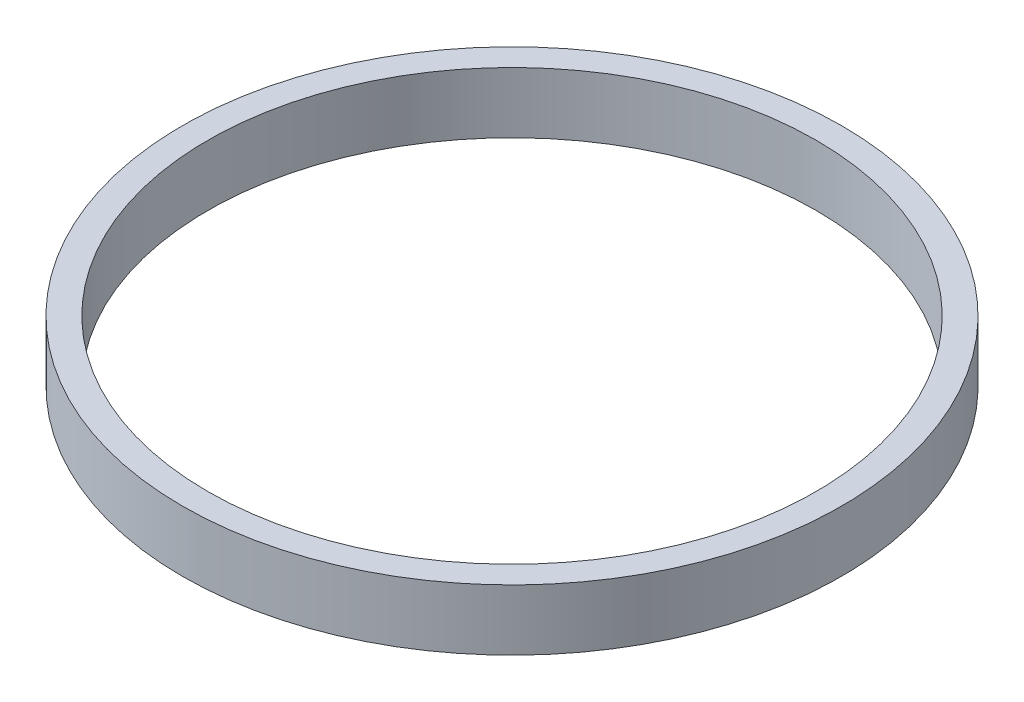
ISO-10303-21;
HEADER;
FILE_DESCRIPTION(('STEP AP214'),'2;1');
FILE_NAME('part.step','',(''),(''),'','','');
FILE_SCHEMA(('AUTOMOTIVE_DESIGN { 1 0 10303 214 1 1 1 1 }'));
ENDSEC;
DATA;
#1=APPLICATION_CONTEXT('core data for automotive mechanical design processes');
#2=APPLICATION_PROTOCOL_DEFINITION('international standard','automotive_design',2000,#1);
#3=PRODUCT_CONTEXT('',#1,'mechanical');
#4=PRODUCT('Part','Part','',(#3));
#5=PRODUCT_RELATED_PRODUCT_CATEGORY('part','',(#4));
#6=PRODUCT_DEFINITION_FORMATION('','',#4);
#7=PRODUCT_DEFINITION_CONTEXT('part definition',#1,'design');
#8=PRODUCT_DEFINITION('design','',#6,#7);
#9=PRODUCT_DEFINITION_SHAPE('','',#8);
#10=(LENGTH_UNIT() NAMED_UNIT(*) SI_UNIT(.MILLI.,.METRE.));
#11=(NAMED_UNIT(*) PLANE_ANGLE_UNIT() SI_UNIT($,.RADIAN.));
#12=(NAMED_UNIT(*) SI_UNIT($,.STERADIAN.) SOLID_ANGLE_UNIT());
#13=UNCERTAINTY_MEASURE_WITH_UNIT(LENGTH_MEASURE(1.E-05),#10,'distance_accuracy_value','');
#14=(GEOMETRIC_REPRESENTATION_CONTEXT(3) GLOBAL_UNCERTAINTY_ASSIGNED_CONTEXT((#13)) GLOBAL_UNIT_ASSIGNED_CONTEXT((#10,
#11,#12)) REPRESENTATION_CONTEXT('',''));
#15=CARTESIAN_POINT('',(0.,0.,0.));
#16=DIRECTION('',(0.,0.,1.));
#17=DIRECTION('',(1.,0.,0.));
#18=AXIS2_PLACEMENT_3D('',#15,#16,#17);
#19=CARTESIAN_POINT('',(0.,6.,0.));
#20=DIRECTION('',(0.,1.,0.));
#21=DIRECTION('',(0.,0.,1.));
#22=AXIS2_PLACEMENT_3D('',#19,#20,#21);
#23=PLANE('',#22);
#24=CARTESIAN_POINT('',(0.,6.,0.));
#25=DIRECTION('',(0.,1.,0.));
#26=DIRECTION('',(0.,0.,1.));
#27=AXIS2_PLACEMENT_3D('',#24,#25,#26);
#28=CIRCLE('',#27,32.5);
#29=CARTESIAN_POINT('',(0.,6.,32.5));
#30=VERTEX_POINT('',#29);
#31=EDGE_CURVE('E10',#30,#30,#28,.T.);
#32=ORIENTED_EDGE('',*,*,#31,.T.);
#33=EDGE_LOOP('',(#32));
#34=FACE_BOUND('',#33,.T.);
#35=CARTESIAN_POINT('',(0.,6.,0.));
#36=DIRECTION('',(0.,1.,0.));
#37=DIRECTION('',(0.,0.,1.));
#38=AXIS2_PLACEMENT_3D('',#35,#36,#37);
#39=CIRCLE('',#38,30.);
#40=CARTESIAN_POINT('',(0.,6.,30.));
#41=VERTEX_POINT('',#40);
#42=EDGE_CURVE('E50',#41,#41,#39,.T.);
#43=ORIENTED_EDGE('',*,*,#42,.F.);
#44=EDGE_LOOP('',(#43));
#45=FACE_BOUND('',#44,.T.);
#46=ADVANCED_FACE('F37',(#34,#45),#23,.T.);
#47=CARTESIAN_POINT('',(0.,0.,0.));
#48=DIRECTION('',(0.,1.,0.));
#49=DIRECTION('',(0.,0.,1.));
#50=AXIS2_PLACEMENT_3D('',#47,#48,#49);
#51=PLANE('',#50);
#52=CARTESIAN_POINT('',(0.,0.,0.));
#53=DIRECTION('',(0.,1.,0.));
#54=DIRECTION('',(0.,0.,1.));
#55=AXIS2_PLACEMENT_3D('',#52,#53,#54);
#56=CIRCLE('',#55,32.5);
#57=CARTESIAN_POINT('',(0.,0.,32.5));
#58=VERTEX_POINT('',#57);
#59=EDGE_CURVE('E41',#58,#58,#56,.T.);
#60=ORIENTED_EDGE('',*,*,#59,.F.);
#61=EDGE_LOOP('',(#60));
#62=FACE_BOUND('',#61,.T.);
#63=CARTESIAN_POINT('',(0.,0.,0.));
#64=DIRECTION('',(0.,1.,0.));
#65=DIRECTION('',(0.,0.,1.));
#66=AXIS2_PLACEMENT_3D('',#63,#64,#65);
#67=CIRCLE('',#66,30.);
#68=CARTESIAN_POINT('',(0.,0.,30.));
#69=VERTEX_POINT('',#68);
#70=EDGE_CURVE('E52',#69,#69,#67,.T.);
#71=ORIENTED_EDGE('',*,*,#70,.T.);
#72=EDGE_LOOP('',(#71));
#73=FACE_BOUND('',#72,.T.);
#74=ADVANCED_FACE('F64',(#62,#73),#51,.F.);
#75=CARTESIAN_POINT('',(0.,6.,0.));
#76=DIRECTION('',(0.,-1.,0.));
#77=DIRECTION('',(0.,0.,-1.));
#78=AXIS2_PLACEMENT_3D('',#75,#76,#77);
#79=CYLINDRICAL_SURFACE('',#78,32.5);
#80=ORIENTED_EDGE('',*,*,#31,.F.);
#81=EDGE_LOOP('',(#80));
#82=FACE_BOUND('',#81,.T.);
#83=ORIENTED_EDGE('',*,*,#59,.T.);
#84=EDGE_LOOP('',(#83));
#85=FACE_BOUND('',#84,.T.);
#86=ADVANCED_FACE('F39',(#82,#85),#79,.T.);
#87=CARTESIAN_POINT('',(0.,6.,0.));
#88=DIRECTION('',(0.,-1.,0.));
#89=DIRECTION('',(0.,0.,-1.));
#90=AXIS2_PLACEMENT_3D('',#87,#88,#89);
#91=CYLINDRICAL_SURFACE('',#90,30.);
#92=ORIENTED_EDGE('',*,*,#42,.T.);
#93=EDGE_LOOP('',(#92));
#94=FACE_BOUND('',#93,.T.);
#95=ORIENTED_EDGE('',*,*,#70,.F.);
#96=EDGE_LOOP('',(#95));
#97=FACE_BOUND('',#96,.T.);
#98=ADVANCED_FACE('F60',(#94,#97),#91,.F.);
#99=CLOSED_SHELL('',(#46,#74,#86,#98));
#100=MANIFOLD_SOLID_BREP('B2',#99);
#101=ADVANCED_BREP_SHAPE_REPRESENTATION('',(#18,#100),#14);
#102=SHAPE_DEFINITION_REPRESENTATION(#9,#101);
ENDSEC;
END-ISO-10303-21;
